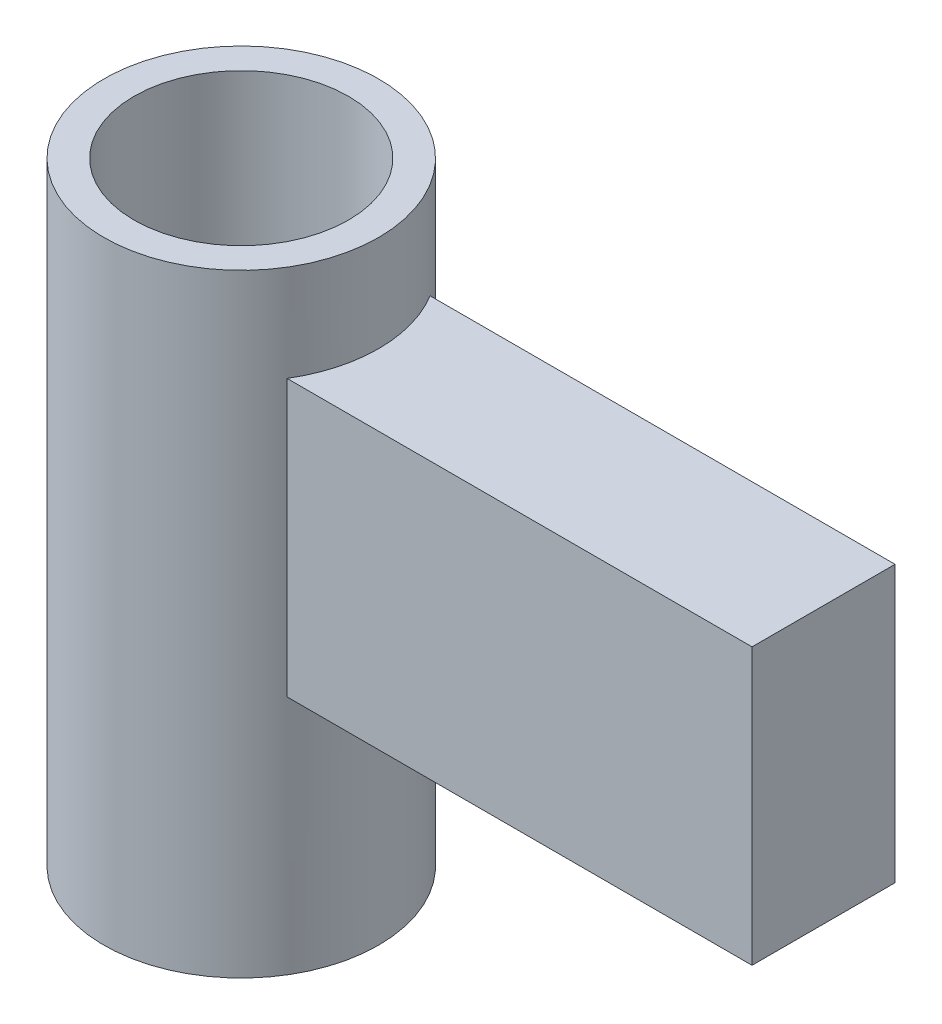
ISO-10303-21;
HEADER;
FILE_DESCRIPTION(('STEP AP214'),'2;1');
FILE_NAME('part.step','',(''),(''),'','','');
FILE_SCHEMA(('AUTOMOTIVE_DESIGN { 1 0 10303 214 1 1 1 1 }'));
ENDSEC;
DATA;
#1=APPLICATION_CONTEXT('core data for automotive mechanical design processes');
#2=APPLICATION_PROTOCOL_DEFINITION('international standard','automotive_design',2000,#1);
#3=PRODUCT_CONTEXT('',#1,'mechanical');
#4=PRODUCT('Part','Part','',(#3));
#5=PRODUCT_RELATED_PRODUCT_CATEGORY('part','',(#4));
#6=PRODUCT_DEFINITION_FORMATION('','',#4);
#7=PRODUCT_DEFINITION_CONTEXT('part definition',#1,'design');
#8=PRODUCT_DEFINITION('design','',#6,#7);
#9=PRODUCT_DEFINITION_SHAPE('','',#8);
#10=(LENGTH_UNIT() NAMED_UNIT(*) SI_UNIT(.MILLI.,.METRE.));
#11=(NAMED_UNIT(*) PLANE_ANGLE_UNIT() SI_UNIT($,.RADIAN.));
#12=(NAMED_UNIT(*) SI_UNIT($,.STERADIAN.) SOLID_ANGLE_UNIT());
#13=UNCERTAINTY_MEASURE_WITH_UNIT(LENGTH_MEASURE(1.E-05),#10,'distance_accuracy_value','');
#14=(GEOMETRIC_REPRESENTATION_CONTEXT(3) GLOBAL_UNCERTAINTY_ASSIGNED_CONTEXT((#13)) GLOBAL_UNIT_ASSIGNED_CONTEXT((#10,
#11,#12)) REPRESENTATION_CONTEXT('',''));
#15=CARTESIAN_POINT('',(0.,0.,0.));
#16=DIRECTION('',(0.,0.,1.));
#17=DIRECTION('',(1.,0.,0.));
#18=AXIS2_PLACEMENT_3D('',#15,#16,#17);
#19=CARTESIAN_POINT('',(0.,60.,0.));
#20=DIRECTION('',(0.,1.,0.));
#21=DIRECTION('',(0.,0.,1.));
#22=AXIS2_PLACEMENT_3D('',#19,#20,#21);
#23=PLANE('',#22);
#24=CARTESIAN_POINT('',(0.,60.,0.));
#25=DIRECTION('',(0.,1.,0.));
#26=DIRECTION('',(1.,0.,0.));
#27=AXIS2_PLACEMENT_3D('',#24,#25,#26);
#28=CIRCLE('',#27,13.45);
#29=CARTESIAN_POINT('',(13.45,60.,0.));
#30=VERTEX_POINT('',#29);
#31=EDGE_CURVE('E168',#30,#30,#28,.T.);
#32=ORIENTED_EDGE('',*,*,#31,.T.);
#33=EDGE_LOOP('',(#32));
#34=FACE_BOUND('',#33,.T.);
#35=CARTESIAN_POINT('',(0.,60.,0.));
#36=DIRECTION('',(0.,1.,0.));
#37=DIRECTION('',(0.,0.,1.));
#38=AXIS2_PLACEMENT_3D('',#35,#36,#37);
#39=CIRCLE('',#38,10.5);
#40=CARTESIAN_POINT('',(0.,60.,10.5));
#41=VERTEX_POINT('',#40);
#42=EDGE_CURVE('E162',#41,#41,#39,.T.);
#43=ORIENTED_EDGE('',*,*,#42,.F.);
#44=EDGE_LOOP('',(#43));
#45=FACE_BOUND('',#44,.T.);
#46=ADVANCED_FACE('F39',(#34,#45),#23,.T.);
#47=CARTESIAN_POINT('',(0.,0.,0.));
#48=DIRECTION('',(0.,1.,0.));
#49=DIRECTION('',(0.,0.,1.));
#50=AXIS2_PLACEMENT_3D('',#47,#48,#49);
#51=PLANE('',#50);
#52=CARTESIAN_POINT('',(0.,0.,0.));
#53=DIRECTION('',(0.,1.,0.));
#54=DIRECTION('',(1.,0.,0.));
#55=AXIS2_PLACEMENT_3D('',#52,#53,#54);
#56=CIRCLE('',#55,13.45);
#57=CARTESIAN_POINT('',(13.45,0.,0.));
#58=VERTEX_POINT('',#57);
#59=EDGE_CURVE('E165',#58,#58,#56,.T.);
#60=ORIENTED_EDGE('',*,*,#59,.F.);
#61=EDGE_LOOP('',(#60));
#62=FACE_BOUND('',#61,.T.);
#63=CARTESIAN_POINT('',(0.,0.,0.));
#64=DIRECTION('',(0.,1.,0.));
#65=DIRECTION('',(0.,0.,1.));
#66=AXIS2_PLACEMENT_3D('',#63,#64,#65);
#67=CIRCLE('',#66,10.5);
#68=CARTESIAN_POINT('',(0.,0.,10.5));
#69=VERTEX_POINT('',#68);
#70=EDGE_CURVE('E161',#69,#69,#67,.T.);
#71=ORIENTED_EDGE('',*,*,#70,.T.);
#72=EDGE_LOOP('',(#71));
#73=FACE_BOUND('',#72,.T.);
#74=ADVANCED_FACE('F207',(#62,#73),#51,.F.);
#75=CARTESIAN_POINT('',(0.,60.,0.));
#76=DIRECTION('',(0.,-1.,0.));
#77=DIRECTION('',(0.,0.,-1.));
#78=AXIS2_PLACEMENT_3D('',#75,#76,#77);
#79=CYLINDRICAL_SURFACE('',#78,13.45);
#80=CARTESIAN_POINT('',(0.,50.5713290622291,0.));
#81=DIRECTION('',(0.,1.,0.));
#82=DIRECTION('',(0.,0.,1.));
#83=AXIS2_PLACEMENT_3D('',#80,#81,#82);
#84=CIRCLE('',#83,13.45);
#85=CARTESIAN_POINT('',(11.4848813663897,50.5713290622291,6.99999999999671));
#86=VERTEX_POINT('',#85);
#87=CARTESIAN_POINT('',(11.4848813663857,50.5713290622291,-7.00000000000329));
#88=VERTEX_POINT('',#87);
#89=EDGE_CURVE('E143',#86,#88,#84,.T.);
#90=ORIENTED_EDGE('',*,*,#89,.T.);
#91=DIRECTION('',(0.,-1.,0.));
#92=VECTOR('',#91,1.);
#93=CARTESIAN_POINT('',(11.4848813663857,60.,-7.00000000000329));
#94=LINE('',#93,#92);
#95=CARTESIAN_POINT('',(11.4848813663857,23.5713290622291,-7.0000000000033));
#96=VERTEX_POINT('',#95);
#97=EDGE_CURVE('E106',#88,#96,#94,.T.);
#98=ORIENTED_EDGE('',*,*,#97,.T.);
#99=CARTESIAN_POINT('',(0.,23.5713290622291,0.));
#100=DIRECTION('',(0.,-1.,0.));
#101=DIRECTION('',(0.,0.,-1.));
#102=AXIS2_PLACEMENT_3D('',#99,#100,#101);
#103=CIRCLE('',#102,13.45);
#104=CARTESIAN_POINT('',(11.4848813663897,23.5713290622291,6.9999999999967));
#105=VERTEX_POINT('',#104);
#106=EDGE_CURVE('E157',#96,#105,#103,.T.);
#107=ORIENTED_EDGE('',*,*,#106,.T.);
#108=DIRECTION('',(0.,-1.,0.));
#109=VECTOR('',#108,1.);
#110=CARTESIAN_POINT('',(11.4848813663897,60.,6.99999999999671));
#111=LINE('',#110,#109);
#112=EDGE_CURVE('E154',#105,#86,#111,.F.);
#113=ORIENTED_EDGE('',*,*,#112,.T.);
#114=EDGE_LOOP('',(#90,#98,#107,#113));
#115=FACE_BOUND('',#114,.T.);
#116=ORIENTED_EDGE('',*,*,#31,.F.);
#117=EDGE_LOOP('',(#116));
#118=FACE_BOUND('',#117,.T.);
#119=ORIENTED_EDGE('',*,*,#59,.T.);
#120=EDGE_LOOP('',(#119));
#121=FACE_BOUND('',#120,.T.);
#122=ADVANCED_FACE('F41',(#115,#118,#121),#79,.T.);
#123=CARTESIAN_POINT('',(0.,60.,0.));
#124=DIRECTION('',(0.,-1.,0.));
#125=DIRECTION('',(0.,0.,-1.));
#126=AXIS2_PLACEMENT_3D('',#123,#124,#125);
#127=CYLINDRICAL_SURFACE('',#126,10.5);
#128=DIRECTION('',(0.,-1.,0.));
#129=VECTOR('',#128,1.);
#130=CARTESIAN_POINT('',(7.82623792124633,60.,-7.00000000000329));
#131=LINE('',#130,#129);
#132=CARTESIAN_POINT('',(7.82623792124632,50.5713290622291,-7.00000000000329));
#133=VERTEX_POINT('',#132);
#134=CARTESIAN_POINT('',(7.82623792124632,23.5713290622291,-7.0000000000033));
#135=VERTEX_POINT('',#134);
#136=EDGE_CURVE('E12',#133,#135,#131,.T.);
#137=ORIENTED_EDGE('',*,*,#136,.F.);
#138=CARTESIAN_POINT('',(0.,50.5713290622291,0.));
#139=DIRECTION('',(0.,1.,0.));
#140=DIRECTION('',(0.,0.,1.));
#141=AXIS2_PLACEMENT_3D('',#138,#139,#140);
#142=CIRCLE('',#141,10.5);
#143=CARTESIAN_POINT('',(7.82623792125221,50.5713290622291,6.99999999999671));
#144=VERTEX_POINT('',#143);
#145=EDGE_CURVE('E171',#144,#133,#142,.T.);
#146=ORIENTED_EDGE('',*,*,#145,.F.);
#147=DIRECTION('',(0.,-1.,0.));
#148=VECTOR('',#147,1.);
#149=CARTESIAN_POINT('',(7.82623792125221,60.,6.99999999999671));
#150=LINE('',#149,#148);
#151=CARTESIAN_POINT('',(7.82623792125221,23.5713290622291,6.99999999999671));
#152=VERTEX_POINT('',#151);
#153=EDGE_CURVE('E176',#152,#144,#150,.F.);
#154=ORIENTED_EDGE('',*,*,#153,.F.);
#155=CARTESIAN_POINT('',(0.,23.5713290622291,0.));
#156=DIRECTION('',(0.,-1.,0.));
#157=DIRECTION('',(0.,0.,-1.));
#158=AXIS2_PLACEMENT_3D('',#155,#156,#157);
#159=CIRCLE('',#158,10.5);
#160=EDGE_CURVE('E47',#135,#152,#159,.T.);
#161=ORIENTED_EDGE('',*,*,#160,.F.);
#162=EDGE_LOOP('',(#137,#146,#154,#161));
#163=FACE_BOUND('',#162,.T.);
#164=ORIENTED_EDGE('',*,*,#42,.T.);
#165=EDGE_LOOP('',(#164));
#166=FACE_BOUND('',#165,.T.);
#167=ORIENTED_EDGE('',*,*,#70,.F.);
#168=EDGE_LOOP('',(#167));
#169=FACE_BOUND('',#168,.T.);
#170=ADVANCED_FACE('F190',(#163,#166,#169),#127,.F.);
#171=CARTESIAN_POINT('',(5.,0.,0.));
#172=DIRECTION('',(1.,0.,0.));
#173=DIRECTION('',(0.,0.,-1.));
#174=AXIS2_PLACEMENT_3D('',#171,#172,#173);
#175=PLANE('',#174);
#176=DIRECTION('',(0.,1.,0.));
#177=VECTOR('',#176,1.);
#178=CARTESIAN_POINT('',(5.,50.5713290622291,-7.00000000000329));
#179=LINE('',#178,#177);
#180=CARTESIAN_POINT('',(5.,23.5713290622291,-7.0000000000033));
#181=VERTEX_POINT('',#180);
#182=CARTESIAN_POINT('',(5.,50.5713290622291,-7.00000000000329));
#183=VERTEX_POINT('',#182);
#184=EDGE_CURVE('E129',#181,#183,#179,.T.);
#185=ORIENTED_EDGE('',*,*,#184,.F.);
#186=DIRECTION('',(0.,0.,-1.));
#187=VECTOR('',#186,1.);
#188=CARTESIAN_POINT('',(5.,23.5713290622291,6.9999999999967));
#189=LINE('',#188,#187);
#190=CARTESIAN_POINT('',(5.,23.5713290622291,6.9999999999967));
#191=VERTEX_POINT('',#190);
#192=EDGE_CURVE('E109',#191,#181,#189,.T.);
#193=ORIENTED_EDGE('',*,*,#192,.F.);
#194=DIRECTION('',(0.,-1.,0.));
#195=VECTOR('',#194,1.);
#196=CARTESIAN_POINT('',(5.,50.5713290622291,6.99999999999671));
#197=LINE('',#196,#195);
#198=CARTESIAN_POINT('',(5.,50.5713290622291,6.99999999999671));
#199=VERTEX_POINT('',#198);
#200=EDGE_CURVE('E135',#199,#191,#197,.T.);
#201=ORIENTED_EDGE('',*,*,#200,.F.);
#202=DIRECTION('',(0.,0.,1.));
#203=VECTOR('',#202,1.);
#204=CARTESIAN_POINT('',(5.,50.5713290622291,6.99999999999671));
#205=LINE('',#204,#203);
#206=EDGE_CURVE('E132',#183,#199,#205,.T.);
#207=ORIENTED_EDGE('',*,*,#206,.F.);
#208=EDGE_LOOP('',(#185,#193,#201,#207));
#209=FACE_BOUND('',#208,.T.);
#210=ADVANCED_FACE('F187',(#209),#175,.F.);
#211=CARTESIAN_POINT('',(5.,50.5713290622291,6.99999999999671));
#212=DIRECTION('',(0.,1.,0.));
#213=DIRECTION('',(0.,0.,1.));
#214=AXIS2_PLACEMENT_3D('',#211,#212,#213);
#215=PLANE('',#214);
#216=DIRECTION('',(1.,0.,0.));
#217=VECTOR('',#216,1.);
#218=CARTESIAN_POINT('',(5.,50.5713290622291,6.99999999999671));
#219=LINE('',#218,#217);
#220=EDGE_CURVE('E149',#199,#144,#219,.T.);
#221=ORIENTED_EDGE('',*,*,#220,.T.);
#222=ORIENTED_EDGE('',*,*,#145,.T.);
#223=DIRECTION('',(1.,0.,0.));
#224=VECTOR('',#223,1.);
#225=CARTESIAN_POINT('',(5.,50.5713290622291,-7.00000000000329));
#226=LINE('',#225,#224);
#227=EDGE_CURVE('E108',#183,#133,#226,.T.);
#228=ORIENTED_EDGE('',*,*,#227,.F.);
#229=ORIENTED_EDGE('',*,*,#206,.T.);
#230=EDGE_LOOP('',(#221,#222,#228,#229));
#231=FACE_BOUND('',#230,.T.);
#232=ADVANCED_FACE('F193',(#231),#215,.T.);
#233=CARTESIAN_POINT('',(5.,50.5713290622291,6.99999999999671));
#234=DIRECTION('',(0.,0.,1.));
#235=DIRECTION('',(0.,-1.,0.));
#236=AXIS2_PLACEMENT_3D('',#233,#234,#235);
#237=PLANE('',#236);
#238=DIRECTION('',(1.,0.,0.));
#239=VECTOR('',#238,1.);
#240=CARTESIAN_POINT('',(5.,23.5713290622291,6.9999999999967));
#241=LINE('',#240,#239);
#242=EDGE_CURVE('E145',#191,#152,#241,.T.);
#243=ORIENTED_EDGE('',*,*,#242,.T.);
#244=ORIENTED_EDGE('',*,*,#153,.T.);
#245=ORIENTED_EDGE('',*,*,#220,.F.);
#246=ORIENTED_EDGE('',*,*,#200,.T.);
#247=EDGE_LOOP('',(#243,#244,#245,#246));
#248=FACE_BOUND('',#247,.T.);
#249=ADVANCED_FACE('F181',(#248),#237,.T.);
#250=CARTESIAN_POINT('',(5.,23.5713290622291,6.9999999999967));
#251=DIRECTION('',(0.,-1.,0.));
#252=DIRECTION('',(0.,0.,-1.));
#253=AXIS2_PLACEMENT_3D('',#250,#251,#252);
#254=PLANE('',#253);
#255=DIRECTION('',(1.,0.,0.));
#256=VECTOR('',#255,1.);
#257=CARTESIAN_POINT('',(5.,23.5713290622291,-7.0000000000033));
#258=LINE('',#257,#256);
#259=EDGE_CURVE('E140',#181,#135,#258,.T.);
#260=ORIENTED_EDGE('',*,*,#259,.T.);
#261=ORIENTED_EDGE('',*,*,#160,.T.);
#262=ORIENTED_EDGE('',*,*,#242,.F.);
#263=ORIENTED_EDGE('',*,*,#192,.T.);
#264=EDGE_LOOP('',(#260,#261,#262,#263));
#265=FACE_BOUND('',#264,.T.);
#266=ADVANCED_FACE('F179',(#265),#254,.T.);
#267=CARTESIAN_POINT('',(5.,50.5713290622291,-7.00000000000329));
#268=DIRECTION('',(0.,0.,-1.));
#269=DIRECTION('',(0.,1.,0.));
#270=AXIS2_PLACEMENT_3D('',#267,#268,#269);
#271=PLANE('',#270);
#272=ORIENTED_EDGE('',*,*,#227,.T.);
#273=ORIENTED_EDGE('',*,*,#136,.T.);
#274=ORIENTED_EDGE('',*,*,#259,.F.);
#275=ORIENTED_EDGE('',*,*,#184,.T.);
#276=EDGE_LOOP('',(#272,#273,#274,#275));
#277=FACE_BOUND('',#276,.T.);
#278=ADVANCED_FACE('F189',(#277),#271,.T.);
#279=ORIENTED_EDGE('',*,*,#97,.F.);
#280=CARTESIAN_POINT('',(57.,50.5713290622291,-7.00000000000329));
#281=VERTEX_POINT('',#280);
#282=EDGE_CURVE('E54',#88,#281,#226,.T.);
#283=ORIENTED_EDGE('',*,*,#282,.T.);
#284=DIRECTION('',(0.,1.,0.));
#285=VECTOR('',#284,1.);
#286=CARTESIAN_POINT('',(57.,50.5713290622291,-7.00000000000329));
#287=LINE('',#286,#285);
#288=CARTESIAN_POINT('',(57.,23.5713290622291,-7.0000000000033));
#289=VERTEX_POINT('',#288);
#290=EDGE_CURVE('E104',#289,#281,#287,.T.);
#291=ORIENTED_EDGE('',*,*,#290,.F.);
#292=EDGE_CURVE('E144',#96,#289,#258,.T.);
#293=ORIENTED_EDGE('',*,*,#292,.F.);
#294=EDGE_LOOP('',(#279,#283,#291,#293));
#295=FACE_BOUND('',#294,.T.);
#296=ADVANCED_FACE('F101',(#295),#271,.T.);
#297=ORIENTED_EDGE('',*,*,#112,.F.);
#298=CARTESIAN_POINT('',(57.,23.5713290622291,6.9999999999967));
#299=VERTEX_POINT('',#298);
#300=EDGE_CURVE('E148',#105,#299,#241,.T.);
#301=ORIENTED_EDGE('',*,*,#300,.T.);
#302=DIRECTION('',(0.,-1.,0.));
#303=VECTOR('',#302,1.);
#304=CARTESIAN_POINT('',(57.,50.5713290622291,6.99999999999671));
#305=LINE('',#304,#303);
#306=CARTESIAN_POINT('',(57.,50.5713290622291,6.99999999999671));
#307=VERTEX_POINT('',#306);
#308=EDGE_CURVE('E119',#307,#299,#305,.T.);
#309=ORIENTED_EDGE('',*,*,#308,.F.);
#310=EDGE_CURVE('E115',#86,#307,#219,.T.);
#311=ORIENTED_EDGE('',*,*,#310,.F.);
#312=EDGE_LOOP('',(#297,#301,#309,#311));
#313=FACE_BOUND('',#312,.T.);
#314=ADVANCED_FACE('F201',(#313),#237,.T.);
#315=ORIENTED_EDGE('',*,*,#106,.F.);
#316=ORIENTED_EDGE('',*,*,#292,.T.);
#317=DIRECTION('',(0.,0.,-1.));
#318=VECTOR('',#317,1.);
#319=CARTESIAN_POINT('',(57.,23.5713290622291,6.9999999999967));
#320=LINE('',#319,#318);
#321=EDGE_CURVE('E124',#299,#289,#320,.T.);
#322=ORIENTED_EDGE('',*,*,#321,.F.);
#323=ORIENTED_EDGE('',*,*,#300,.F.);
#324=EDGE_LOOP('',(#315,#316,#322,#323));
#325=FACE_BOUND('',#324,.T.);
#326=ADVANCED_FACE('F205',(#325),#254,.T.);
#327=ORIENTED_EDGE('',*,*,#89,.F.);
#328=ORIENTED_EDGE('',*,*,#310,.T.);
#329=DIRECTION('',(0.,0.,1.));
#330=VECTOR('',#329,1.);
#331=CARTESIAN_POINT('',(57.,50.5713290622291,6.99999999999671));
#332=LINE('',#331,#330);
#333=EDGE_CURVE('E112',#281,#307,#332,.T.);
#334=ORIENTED_EDGE('',*,*,#333,.F.);
#335=ORIENTED_EDGE('',*,*,#282,.F.);
#336=EDGE_LOOP('',(#327,#328,#334,#335));
#337=FACE_BOUND('',#336,.T.);
#338=ADVANCED_FACE('F113',(#337),#215,.T.);
#339=CARTESIAN_POINT('',(57.,0.,0.));
#340=DIRECTION('',(1.,0.,0.));
#341=DIRECTION('',(0.,0.,-1.));
#342=AXIS2_PLACEMENT_3D('',#339,#340,#341);
#343=PLANE('',#342);
#344=ORIENTED_EDGE('',*,*,#290,.T.);
#345=ORIENTED_EDGE('',*,*,#333,.T.);
#346=ORIENTED_EDGE('',*,*,#308,.T.);
#347=ORIENTED_EDGE('',*,*,#321,.T.);
#348=EDGE_LOOP('',(#344,#345,#346,#347));
#349=FACE_BOUND('',#348,.T.);
#350=ADVANCED_FACE('F122',(#349),#343,.T.);
#351=CLOSED_SHELL('',(#46,#74,#122,#170,#210,#232,#249,#266,#278,#296,#314,#326,#338,#350));
#352=MANIFOLD_SOLID_BREP('B2',#351);
#353=ADVANCED_BREP_SHAPE_REPRESENTATION('',(#18,#352),#14);
#354=SHAPE_DEFINITION_REPRESENTATION(#9,#353);
ENDSEC;
END-ISO-10303-21;
